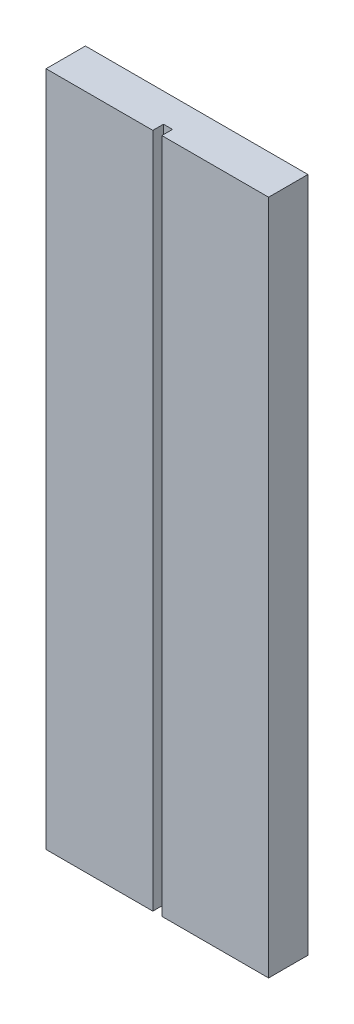
ISO-10303-21;
HEADER;
FILE_DESCRIPTION(('STEP AP214'),'2;1');
FILE_NAME('part.step','',(''),(''),'','','');
FILE_SCHEMA(('AUTOMOTIVE_DESIGN { 1 0 10303 214 1 1 1 1 }'));
ENDSEC;
DATA;
#1=APPLICATION_CONTEXT('core data for automotive mechanical design processes');
#2=APPLICATION_PROTOCOL_DEFINITION('international standard','automotive_design',2000,#1);
#3=PRODUCT_CONTEXT('',#1,'mechanical');
#4=PRODUCT('Part','Part','',(#3));
#5=PRODUCT_RELATED_PRODUCT_CATEGORY('part','',(#4));
#6=PRODUCT_DEFINITION_FORMATION('','',#4);
#7=PRODUCT_DEFINITION_CONTEXT('part definition',#1,'design');
#8=PRODUCT_DEFINITION('design','',#6,#7);
#9=PRODUCT_DEFINITION_SHAPE('','',#8);
#10=(LENGTH_UNIT() NAMED_UNIT(*) SI_UNIT(.MILLI.,.METRE.));
#11=(NAMED_UNIT(*) PLANE_ANGLE_UNIT() SI_UNIT($,.RADIAN.));
#12=(NAMED_UNIT(*) SI_UNIT($,.STERADIAN.) SOLID_ANGLE_UNIT());
#13=UNCERTAINTY_MEASURE_WITH_UNIT(LENGTH_MEASURE(1.E-05),#10,'distance_accuracy_value','');
#14=(GEOMETRIC_REPRESENTATION_CONTEXT(3) GLOBAL_UNCERTAINTY_ASSIGNED_CONTEXT((#13)) GLOBAL_UNIT_ASSIGNED_CONTEXT((#10,
#11,#12)) REPRESENTATION_CONTEXT('',''));
#15=CARTESIAN_POINT('',(0.,0.,0.));
#16=DIRECTION('',(0.,0.,1.));
#17=DIRECTION('',(1.,0.,0.));
#18=AXIS2_PLACEMENT_3D('',#15,#16,#17);
#19=CARTESIAN_POINT('',(-60.7156712323042,-97.6254395709752,46.8996096529735));
#20=DIRECTION('',(0.,0.,1.));
#21=DIRECTION('',(1.,0.,0.));
#22=AXIS2_PLACEMENT_3D('',#19,#20,#21);
#23=PLANE('',#22);
#24=CARTESIAN_POINT('',(-60.7156712323042,-97.6254395709752,46.8996096529735));
#25=CARTESIAN_POINT('',(-58.5156712323042,-97.6254395709751,46.8996096529735));
#26=(BOUNDED_CURVE() B_SPLINE_CURVE(1,(#24,#25),.UNSPECIFIED.,.F.,
.F.) B_SPLINE_CURVE_WITH_KNOTS((2,2),(0.,2.2),
.UNSPECIFIED.) CURVE() GEOMETRIC_REPRESENTATION_ITEM() RATIONAL_B_SPLINE_CURVE((1.,1.)) REPRESENTATION_ITEM(''));
#27=CARTESIAN_POINT('',(-60.7156712323042,-97.6254395709752,46.8996096529735));
#28=VERTEX_POINT('',#27);
#29=CARTESIAN_POINT('',(-58.5156712323042,-97.6254395709751,46.8996096529735));
#30=VERTEX_POINT('',#29);
#31=EDGE_CURVE('E205',#28,#30,#26,.T.);
#32=ORIENTED_EDGE('',*,*,#31,.F.);
#33=CARTESIAN_POINT('',(-60.7156712323042,-97.6254395709752,46.8996096529735));
#34=CARTESIAN_POINT('',(-60.7156712323001,-262.625439570975,46.8996096529735));
#35=(BOUNDED_CURVE() B_SPLINE_CURVE(1,(#33,#34),.UNSPECIFIED.,.F.,
.F.) B_SPLINE_CURVE_WITH_KNOTS((2,2),(-165.,0.),
.UNSPECIFIED.) CURVE() GEOMETRIC_REPRESENTATION_ITEM() RATIONAL_B_SPLINE_CURVE((1.,1.)) REPRESENTATION_ITEM(''));
#36=CARTESIAN_POINT('',(-60.7156712323001,-262.625439570975,46.8996096529735));
#37=VERTEX_POINT('',#36);
#38=EDGE_CURVE('E10',#28,#37,#35,.T.);
#39=ORIENTED_EDGE('',*,*,#38,.T.);
#40=CARTESIAN_POINT('',(-58.5156712323001,-262.625439570975,46.8996096529735));
#41=CARTESIAN_POINT('',(-60.7156712323001,-262.625439570975,46.8996096529735));
#42=(BOUNDED_CURVE() B_SPLINE_CURVE(1,(#40,#41),.UNSPECIFIED.,.F.,
.F.) B_SPLINE_CURVE_WITH_KNOTS((2,2),(0.,2.2),
.UNSPECIFIED.) CURVE() GEOMETRIC_REPRESENTATION_ITEM() RATIONAL_B_SPLINE_CURVE((1.,1.)) REPRESENTATION_ITEM(''));
#43=CARTESIAN_POINT('',(-58.5156712323001,-262.625439570975,46.8996096529735));
#44=VERTEX_POINT('',#43);
#45=EDGE_CURVE('E248',#44,#37,#42,.T.);
#46=ORIENTED_EDGE('',*,*,#45,.F.);
#47=CARTESIAN_POINT('',(-58.5156712323001,-262.625439570975,46.8996096529735));
#48=CARTESIAN_POINT('',(-58.5156712323042,-97.6254395709751,46.8996096529735));
#49=(BOUNDED_CURVE() B_SPLINE_CURVE(1,(#47,#48),.UNSPECIFIED.,.F.,
.F.) B_SPLINE_CURVE_WITH_KNOTS((2,2),(-165.,0.),
.UNSPECIFIED.) CURVE() GEOMETRIC_REPRESENTATION_ITEM() RATIONAL_B_SPLINE_CURVE((1.,1.)) REPRESENTATION_ITEM(''));
#50=EDGE_CURVE('E26',#44,#30,#49,.T.);
#51=ORIENTED_EDGE('',*,*,#50,.T.);
#52=EDGE_LOOP('',(#32,#39,#46,#51));
#53=FACE_BOUND('',#52,.T.);
#54=ADVANCED_FACE('F16',(#53),#23,.T.);
#55=CARTESIAN_POINT('',(-60.7156712323042,-97.6254395709752,46.8996096529735));
#56=DIRECTION('',(1.,0.,0.));
#57=DIRECTION('',(0.,1.,0.));
#58=AXIS2_PLACEMENT_3D('',#55,#56,#57);
#59=PLANE('',#58);
#60=CARTESIAN_POINT('',(-60.7156712323001,-262.625439570975,46.8996096529735));
#61=CARTESIAN_POINT('',(-60.7156712323001,-262.625439570975,49.4996096529735));
#62=(BOUNDED_CURVE() B_SPLINE_CURVE(1,(#60,#61),.UNSPECIFIED.,.F.,
.F.) B_SPLINE_CURVE_WITH_KNOTS((2,2),(0.,2.6),
.UNSPECIFIED.) CURVE() GEOMETRIC_REPRESENTATION_ITEM() RATIONAL_B_SPLINE_CURVE((1.,1.)) REPRESENTATION_ITEM(''));
#63=CARTESIAN_POINT('',(-60.7156712323001,-262.625439570975,49.4996096529735));
#64=VERTEX_POINT('',#63);
#65=EDGE_CURVE('E257',#37,#64,#62,.T.);
#66=ORIENTED_EDGE('',*,*,#65,.F.);
#67=ORIENTED_EDGE('',*,*,#38,.F.);
#68=CARTESIAN_POINT('',(-60.7156712323042,-97.6254395709752,49.4996096529735));
#69=CARTESIAN_POINT('',(-60.7156712323042,-97.6254395709752,46.8996096529735));
#70=(BOUNDED_CURVE() B_SPLINE_CURVE(1,(#68,#69),.UNSPECIFIED.,.F.,
.F.) B_SPLINE_CURVE_WITH_KNOTS((2,2),(0.,2.6),
.UNSPECIFIED.) CURVE() GEOMETRIC_REPRESENTATION_ITEM() RATIONAL_B_SPLINE_CURVE((1.,1.)) REPRESENTATION_ITEM(''));
#71=CARTESIAN_POINT('',(-60.7156712323042,-97.6254395709752,49.4996096529735));
#72=VERTEX_POINT('',#71);
#73=EDGE_CURVE('E189',#72,#28,#70,.T.);
#74=ORIENTED_EDGE('',*,*,#73,.F.);
#75=CARTESIAN_POINT('',(-60.7156712323042,-97.6254395709752,49.4996096529735));
#76=CARTESIAN_POINT('',(-60.7156712323001,-262.625439570975,49.4996096529735));
#77=(BOUNDED_CURVE() B_SPLINE_CURVE(1,(#75,#76),.UNSPECIFIED.,.F.,
.F.) B_SPLINE_CURVE_WITH_KNOTS((2,2),(-165.,0.),
.UNSPECIFIED.) CURVE() GEOMETRIC_REPRESENTATION_ITEM() RATIONAL_B_SPLINE_CURVE((1.,1.)) REPRESENTATION_ITEM(''));
#78=EDGE_CURVE('E38',#72,#64,#77,.T.);
#79=ORIENTED_EDGE('',*,*,#78,.T.);
#80=EDGE_LOOP('',(#66,#67,#74,#79));
#81=FACE_BOUND('',#80,.T.);
#82=ADVANCED_FACE('F424',(#81),#59,.T.);
#83=CARTESIAN_POINT('',(-58.5156712323001,-262.625439570975,46.8996096529735));
#84=DIRECTION('',(-1.,0.,0.));
#85=DIRECTION('',(0.,0.,1.));
#86=AXIS2_PLACEMENT_3D('',#83,#84,#85);
#87=PLANE('',#86);
#88=CARTESIAN_POINT('',(-58.5156712323042,-97.6254395709751,46.8996096529735));
#89=CARTESIAN_POINT('',(-58.5156712323042,-97.6254395709751,49.4996096529735));
#90=(BOUNDED_CURVE() B_SPLINE_CURVE(1,(#88,#89),.UNSPECIFIED.,.F.,
.F.) B_SPLINE_CURVE_WITH_KNOTS((2,2),(0.,2.6),
.UNSPECIFIED.) CURVE() GEOMETRIC_REPRESENTATION_ITEM() RATIONAL_B_SPLINE_CURVE((1.,1.)) REPRESENTATION_ITEM(''));
#91=CARTESIAN_POINT('',(-58.5156712323042,-97.6254395709751,49.4996096529735));
#92=VERTEX_POINT('',#91);
#93=EDGE_CURVE('E124',#30,#92,#90,.T.);
#94=ORIENTED_EDGE('',*,*,#93,.F.);
#95=ORIENTED_EDGE('',*,*,#50,.F.);
#96=CARTESIAN_POINT('',(-58.5156712323001,-262.625439570975,49.4996096529735));
#97=CARTESIAN_POINT('',(-58.5156712323001,-262.625439570975,46.8996096529735));
#98=(BOUNDED_CURVE() B_SPLINE_CURVE(1,(#96,#97),.UNSPECIFIED.,.F.,
.F.) B_SPLINE_CURVE_WITH_KNOTS((2,2),(0.,2.6),
.UNSPECIFIED.) CURVE() GEOMETRIC_REPRESENTATION_ITEM() RATIONAL_B_SPLINE_CURVE((1.,1.)) REPRESENTATION_ITEM(''));
#99=CARTESIAN_POINT('',(-58.5156712323001,-262.625439570975,49.4996096529735));
#100=VERTEX_POINT('',#99);
#101=EDGE_CURVE('E239',#100,#44,#98,.T.);
#102=ORIENTED_EDGE('',*,*,#101,.F.);
#103=CARTESIAN_POINT('',(-58.5156712323001,-262.625439570975,49.4996096529735));
#104=CARTESIAN_POINT('',(-58.5156712323042,-97.6254395709751,49.4996096529735));
#105=(BOUNDED_CURVE() B_SPLINE_CURVE(1,(#103,#104),.UNSPECIFIED.,.F.,
.F.) B_SPLINE_CURVE_WITH_KNOTS((2,2),(-165.,0.),
.UNSPECIFIED.) CURVE() GEOMETRIC_REPRESENTATION_ITEM() RATIONAL_B_SPLINE_CURVE((1.,1.)) REPRESENTATION_ITEM(''));
#106=EDGE_CURVE('E138',#100,#92,#105,.T.);
#107=ORIENTED_EDGE('',*,*,#106,.T.);
#108=EDGE_LOOP('',(#94,#95,#102,#107));
#109=FACE_BOUND('',#108,.T.);
#110=ADVANCED_FACE('F299',(#109),#87,.T.);
#111=CARTESIAN_POINT('',(-86.7656712323001,-262.625439570976,39.8996096529735));
#112=DIRECTION('',(0.,0.,-1.));
#113=DIRECTION('',(0.,-1.,0.));
#114=AXIS2_PLACEMENT_3D('',#111,#112,#113);
#115=PLANE('',#114);
#116=CARTESIAN_POINT('',(-32.4656712323001,-262.625439570974,39.8996096529735));
#117=CARTESIAN_POINT('',(-32.4656712323042,-97.6254395709745,39.8996096529735));
#118=(BOUNDED_CURVE() B_SPLINE_CURVE(1,(#116,#117),.UNSPECIFIED.,.F.,
.F.) B_SPLINE_CURVE_WITH_KNOTS((2,2),(0.,165.),
.UNSPECIFIED.) CURVE() GEOMETRIC_REPRESENTATION_ITEM() RATIONAL_B_SPLINE_CURVE((1.,1.)) REPRESENTATION_ITEM(''));
#119=CARTESIAN_POINT('',(-32.4656712323001,-262.625439570974,39.8996096529735));
#120=VERTEX_POINT('',#119);
#121=CARTESIAN_POINT('',(-32.4656712323042,-97.6254395709745,39.8996096529735));
#122=VERTEX_POINT('',#121);
#123=EDGE_CURVE('E113',#120,#122,#118,.T.);
#124=ORIENTED_EDGE('',*,*,#123,.F.);
#125=CARTESIAN_POINT('',(-86.7656712323001,-262.625439570976,39.8996096529735));
#126=CARTESIAN_POINT('',(-32.4656712323001,-262.625439570974,39.8996096529735));
#127=(BOUNDED_CURVE() B_SPLINE_CURVE(1,(#125,#126),.UNSPECIFIED.,.F.,
.F.) B_SPLINE_CURVE_WITH_KNOTS((2,2),(0.,54.),
.UNSPECIFIED.) CURVE() GEOMETRIC_REPRESENTATION_ITEM() RATIONAL_B_SPLINE_CURVE((1.,1.)) REPRESENTATION_ITEM(''));
#128=CARTESIAN_POINT('',(-86.7656712323001,-262.625439570976,39.8996096529735));
#129=VERTEX_POINT('',#128);
#130=EDGE_CURVE('E274',#129,#120,#127,.T.);
#131=ORIENTED_EDGE('',*,*,#130,.F.);
#132=CARTESIAN_POINT('',(-86.7656712323001,-262.625439570976,39.8996096529735));
#133=CARTESIAN_POINT('',(-86.7656712323042,-97.6254395709759,39.8996096529735));
#134=(BOUNDED_CURVE() B_SPLINE_CURVE(1,(#132,#133),.UNSPECIFIED.,.F.,
.F.) B_SPLINE_CURVE_WITH_KNOTS((2,2),(-165.,0.),
.UNSPECIFIED.) CURVE() GEOMETRIC_REPRESENTATION_ITEM() RATIONAL_B_SPLINE_CURVE((1.,1.)) REPRESENTATION_ITEM(''));
#135=CARTESIAN_POINT('',(-86.7656712323042,-97.6254395709759,39.8996096529735));
#136=VERTEX_POINT('',#135);
#137=EDGE_CURVE('E223',#129,#136,#134,.T.);
#138=ORIENTED_EDGE('',*,*,#137,.T.);
#139=CARTESIAN_POINT('',(-32.4656712323042,-97.6254395709745,39.8996096529735));
#140=CARTESIAN_POINT('',(-86.7656712323042,-97.6254395709759,39.8996096529735));
#141=(BOUNDED_CURVE() B_SPLINE_CURVE(1,(#139,#140),.UNSPECIFIED.,.F.,
.F.) B_SPLINE_CURVE_WITH_KNOTS((2,2),(0.,54.),
.UNSPECIFIED.) CURVE() GEOMETRIC_REPRESENTATION_ITEM() RATIONAL_B_SPLINE_CURVE((1.,1.)) REPRESENTATION_ITEM(''));
#142=EDGE_CURVE('E160',#122,#136,#141,.T.);
#143=ORIENTED_EDGE('',*,*,#142,.F.);
#144=EDGE_LOOP('',(#124,#131,#138,#143));
#145=FACE_BOUND('',#144,.T.);
#146=ADVANCED_FACE('F407',(#145),#115,.T.);
#147=CARTESIAN_POINT('',(-86.7656712323001,-262.625439570976,49.4996096529735));
#148=DIRECTION('',(0.,0.,1.));
#149=DIRECTION('',(1.,0.,0.));
#150=AXIS2_PLACEMENT_3D('',#147,#148,#149);
#151=PLANE('',#150);
#152=ORIENTED_EDGE('',*,*,#78,.F.);
#153=CARTESIAN_POINT('',(-86.7656712323042,-97.6254395709759,49.4996096529735));
#154=CARTESIAN_POINT('',(-60.7156712323042,-97.6254395709752,49.4996096529735));
#155=(BOUNDED_CURVE() B_SPLINE_CURVE(1,(#153,#154),.UNSPECIFIED.,.F.,
.F.) B_SPLINE_CURVE_WITH_KNOTS((2,2),(0.,25.9),
.UNSPECIFIED.) CURVE() GEOMETRIC_REPRESENTATION_ITEM() RATIONAL_B_SPLINE_CURVE((1.,1.)) REPRESENTATION_ITEM(''));
#156=CARTESIAN_POINT('',(-86.7656712323042,-97.6254395709759,49.4996096529735));
#157=VERTEX_POINT('',#156);
#158=EDGE_CURVE('E159',#157,#72,#155,.T.);
#159=ORIENTED_EDGE('',*,*,#158,.F.);
#160=CARTESIAN_POINT('',(-86.7656712323042,-97.6254395709759,49.4996096529735));
#161=CARTESIAN_POINT('',(-86.7656712323001,-262.625439570976,49.4996096529735));
#162=(BOUNDED_CURVE() B_SPLINE_CURVE(1,(#160,#161),.UNSPECIFIED.,.F.,
.F.) B_SPLINE_CURVE_WITH_KNOTS((2,2),(-165.,0.),
.UNSPECIFIED.) CURVE() GEOMETRIC_REPRESENTATION_ITEM() RATIONAL_B_SPLINE_CURVE((1.,1.)) REPRESENTATION_ITEM(''));
#163=CARTESIAN_POINT('',(-86.7656712323001,-262.625439570976,49.4996096529735));
#164=VERTEX_POINT('',#163);
#165=EDGE_CURVE('E214',#157,#164,#162,.T.);
#166=ORIENTED_EDGE('',*,*,#165,.T.);
#167=CARTESIAN_POINT('',(-60.7156712323001,-262.625439570975,49.4996096529735));
#168=CARTESIAN_POINT('',(-86.7656712323001,-262.625439570976,49.4996096529735));
#169=(BOUNDED_CURVE() B_SPLINE_CURVE(1,(#167,#168),.UNSPECIFIED.,.F.,
.F.) B_SPLINE_CURVE_WITH_KNOTS((2,2),(0.,25.9),
.UNSPECIFIED.) CURVE() GEOMETRIC_REPRESENTATION_ITEM() RATIONAL_B_SPLINE_CURVE((1.,1.)) REPRESENTATION_ITEM(''));
#170=EDGE_CURVE('E266',#64,#164,#169,.T.);
#171=ORIENTED_EDGE('',*,*,#170,.F.);
#172=EDGE_LOOP('',(#152,#159,#166,#171));
#173=FACE_BOUND('',#172,.T.);
#174=ADVANCED_FACE('F391',(#173),#151,.T.);
#175=CARTESIAN_POINT('',(-86.7656712323001,-262.625439570976,39.8996096529735));
#176=DIRECTION('',(0.,-1.,0.));
#177=DIRECTION('',(0.,0.,-1.));
#178=AXIS2_PLACEMENT_3D('',#175,#176,#177);
#179=PLANE('',#178);
#180=ORIENTED_EDGE('',*,*,#101,.T.);
#181=ORIENTED_EDGE('',*,*,#45,.T.);
#182=ORIENTED_EDGE('',*,*,#65,.T.);
#183=ORIENTED_EDGE('',*,*,#170,.T.);
#184=CARTESIAN_POINT('',(-86.7656712323001,-262.625439570976,49.4996096529735));
#185=CARTESIAN_POINT('',(-86.7656712323001,-262.625439570976,39.8996096529735));
#186=(BOUNDED_CURVE() B_SPLINE_CURVE(1,(#184,#185),.UNSPECIFIED.,.F.,
.F.) B_SPLINE_CURVE_WITH_KNOTS((2,2),(-9.6,0.),
.UNSPECIFIED.) CURVE() GEOMETRIC_REPRESENTATION_ITEM() RATIONAL_B_SPLINE_CURVE((1.,1.)) REPRESENTATION_ITEM(''));
#187=EDGE_CURVE('E213',#164,#129,#186,.T.);
#188=ORIENTED_EDGE('',*,*,#187,.T.);
#189=ORIENTED_EDGE('',*,*,#130,.T.);
#190=CARTESIAN_POINT('',(-32.4656712323001,-262.625439570974,49.4996096529735));
#191=CARTESIAN_POINT('',(-32.4656712323001,-262.625439570974,39.8996096529735));
#192=(BOUNDED_CURVE() B_SPLINE_CURVE(1,(#190,#191),.UNSPECIFIED.,.F.,
.F.) B_SPLINE_CURVE_WITH_KNOTS((2,2),(0.,9.6),
.UNSPECIFIED.) CURVE() GEOMETRIC_REPRESENTATION_ITEM() RATIONAL_B_SPLINE_CURVE((1.,1.)) REPRESENTATION_ITEM(''));
#193=CARTESIAN_POINT('',(-32.4656712323001,-262.625439570974,49.4996096529735));
#194=VERTEX_POINT('',#193);
#195=EDGE_CURVE('E117',#194,#120,#192,.T.);
#196=ORIENTED_EDGE('',*,*,#195,.F.);
#197=CARTESIAN_POINT('',(-32.4656712323001,-262.625439570974,49.4996096529735));
#198=CARTESIAN_POINT('',(-58.5156712323001,-262.625439570975,49.4996096529735));
#199=(BOUNDED_CURVE() B_SPLINE_CURVE(1,(#197,#198),.UNSPECIFIED.,.F.,
.F.) B_SPLINE_CURVE_WITH_KNOTS((2,2),(-25.9,0.),
.UNSPECIFIED.) CURVE() GEOMETRIC_REPRESENTATION_ITEM() RATIONAL_B_SPLINE_CURVE((1.,1.)) REPRESENTATION_ITEM(''));
#200=EDGE_CURVE('E132',#194,#100,#199,.T.);
#201=ORIENTED_EDGE('',*,*,#200,.T.);
#202=EDGE_LOOP('',(#180,#181,#182,#183,#188,#189,#196,#201));
#203=FACE_BOUND('',#202,.T.);
#204=ADVANCED_FACE('F386',(#203),#179,.T.);
#205=CARTESIAN_POINT('',(-86.7656712323,-262.625439570976,39.8996096529735));
#206=DIRECTION('',(-1.,0.,0.));
#207=DIRECTION('',(0.,0.,1.));
#208=AXIS2_PLACEMENT_3D('',#205,#206,#207);
#209=PLANE('',#208);
#210=ORIENTED_EDGE('',*,*,#187,.F.);
#211=ORIENTED_EDGE('',*,*,#165,.F.);
#212=CARTESIAN_POINT('',(-86.7656712323042,-97.6254395709759,39.8996096529735));
#213=CARTESIAN_POINT('',(-86.7656712323042,-97.6254395709759,49.4996096529735));
#214=(BOUNDED_CURVE() B_SPLINE_CURVE(1,(#212,#213),.UNSPECIFIED.,.F.,
.F.) B_SPLINE_CURVE_WITH_KNOTS((2,2),(0.,9.6),
.UNSPECIFIED.) CURVE() GEOMETRIC_REPRESENTATION_ITEM() RATIONAL_B_SPLINE_CURVE((1.,1.)) REPRESENTATION_ITEM(''));
#215=EDGE_CURVE('E151',#136,#157,#214,.T.);
#216=ORIENTED_EDGE('',*,*,#215,.F.);
#217=ORIENTED_EDGE('',*,*,#137,.F.);
#218=EDGE_LOOP('',(#210,#211,#216,#217));
#219=FACE_BOUND('',#218,.T.);
#220=ADVANCED_FACE('F381',(#219),#209,.T.);
#221=CARTESIAN_POINT('',(-32.4656712323042,-97.6254395709744,39.8996096529735));
#222=DIRECTION('',(0.,1.,0.));
#223=DIRECTION('',(1.,0.,0.));
#224=AXIS2_PLACEMENT_3D('',#221,#222,#223);
#225=PLANE('',#224);
#226=ORIENTED_EDGE('',*,*,#93,.T.);
#227=CARTESIAN_POINT('',(-58.5156712323042,-97.6254395709751,49.4996096529735));
#228=CARTESIAN_POINT('',(-32.4656712323042,-97.6254395709745,49.4996096529735));
#229=(BOUNDED_CURVE() B_SPLINE_CURVE(1,(#227,#228),.UNSPECIFIED.,.F.,
.F.) B_SPLINE_CURVE_WITH_KNOTS((2,2),(-25.9,0.),
.UNSPECIFIED.) CURVE() GEOMETRIC_REPRESENTATION_ITEM() RATIONAL_B_SPLINE_CURVE((1.,1.)) REPRESENTATION_ITEM(''));
#230=CARTESIAN_POINT('',(-32.4656712323042,-97.6254395709745,49.4996096529735));
#231=VERTEX_POINT('',#230);
#232=EDGE_CURVE('E120',#92,#231,#229,.T.);
#233=ORIENTED_EDGE('',*,*,#232,.T.);
#234=CARTESIAN_POINT('',(-32.4656712323042,-97.6254395709745,39.8996096529735));
#235=CARTESIAN_POINT('',(-32.4656712323042,-97.6254395709745,49.4996096529735));
#236=(BOUNDED_CURVE() B_SPLINE_CURVE(1,(#234,#235),.UNSPECIFIED.,.F.,
.F.) B_SPLINE_CURVE_WITH_KNOTS((2,2),(0.,9.6),
.UNSPECIFIED.) CURVE() GEOMETRIC_REPRESENTATION_ITEM() RATIONAL_B_SPLINE_CURVE((1.,1.)) REPRESENTATION_ITEM(''));
#237=EDGE_CURVE('E105',#122,#231,#236,.T.);
#238=ORIENTED_EDGE('',*,*,#237,.F.);
#239=ORIENTED_EDGE('',*,*,#142,.T.);
#240=ORIENTED_EDGE('',*,*,#215,.T.);
#241=ORIENTED_EDGE('',*,*,#158,.T.);
#242=ORIENTED_EDGE('',*,*,#73,.T.);
#243=ORIENTED_EDGE('',*,*,#31,.T.);
#244=EDGE_LOOP('',(#226,#233,#238,#239,#240,#241,#242,#243));
#245=FACE_BOUND('',#244,.T.);
#246=ADVANCED_FACE('F121',(#245),#225,.T.);
#247=CARTESIAN_POINT('',(-32.4656712323001,-262.625439570974,39.8996096529735));
#248=DIRECTION('',(1.,0.,0.));
#249=DIRECTION('',(0.,1.,0.));
#250=AXIS2_PLACEMENT_3D('',#247,#248,#249);
#251=PLANE('',#250);
#252=ORIENTED_EDGE('',*,*,#123,.T.);
#253=ORIENTED_EDGE('',*,*,#237,.T.);
#254=CARTESIAN_POINT('',(-32.4656712323042,-97.6254395709745,49.4996096529735));
#255=CARTESIAN_POINT('',(-32.4656712323001,-262.625439570974,49.4996096529735));
#256=(BOUNDED_CURVE() B_SPLINE_CURVE(1,(#254,#255),.UNSPECIFIED.,.F.,
.F.) B_SPLINE_CURVE_WITH_KNOTS((2,2),(-165.,0.),
.UNSPECIFIED.) CURVE() GEOMETRIC_REPRESENTATION_ITEM() RATIONAL_B_SPLINE_CURVE((1.,1.)) REPRESENTATION_ITEM(''));
#257=EDGE_CURVE('E110',#231,#194,#256,.T.);
#258=ORIENTED_EDGE('',*,*,#257,.T.);
#259=ORIENTED_EDGE('',*,*,#195,.T.);
#260=EDGE_LOOP('',(#252,#253,#258,#259));
#261=FACE_BOUND('',#260,.T.);
#262=ADVANCED_FACE('F107',(#261),#251,.T.);
#263=CARTESIAN_POINT('',(-58.5156712323001,-262.625439570975,49.4996096529735));
#264=DIRECTION('',(0.,0.,1.));
#265=DIRECTION('',(1.,0.,0.));
#266=AXIS2_PLACEMENT_3D('',#263,#264,#265);
#267=PLANE('',#266);
#268=ORIENTED_EDGE('',*,*,#106,.F.);
#269=ORIENTED_EDGE('',*,*,#200,.F.);
#270=ORIENTED_EDGE('',*,*,#257,.F.);
#271=ORIENTED_EDGE('',*,*,#232,.F.);
#272=EDGE_LOOP('',(#268,#269,#270,#271));
#273=FACE_BOUND('',#272,.T.);
#274=ADVANCED_FACE('F130',(#273),#267,.T.);
#275=CLOSED_SHELL('',(#54,#82,#110,#146,#174,#204,#220,#246,#262,#274));
#276=MANIFOLD_SOLID_BREP('B1',#275);
#277=ADVANCED_BREP_SHAPE_REPRESENTATION('',(#18,#276),#14);
#278=SHAPE_DEFINITION_REPRESENTATION(#9,#277);
ENDSEC;
END-ISO-10303-21;
